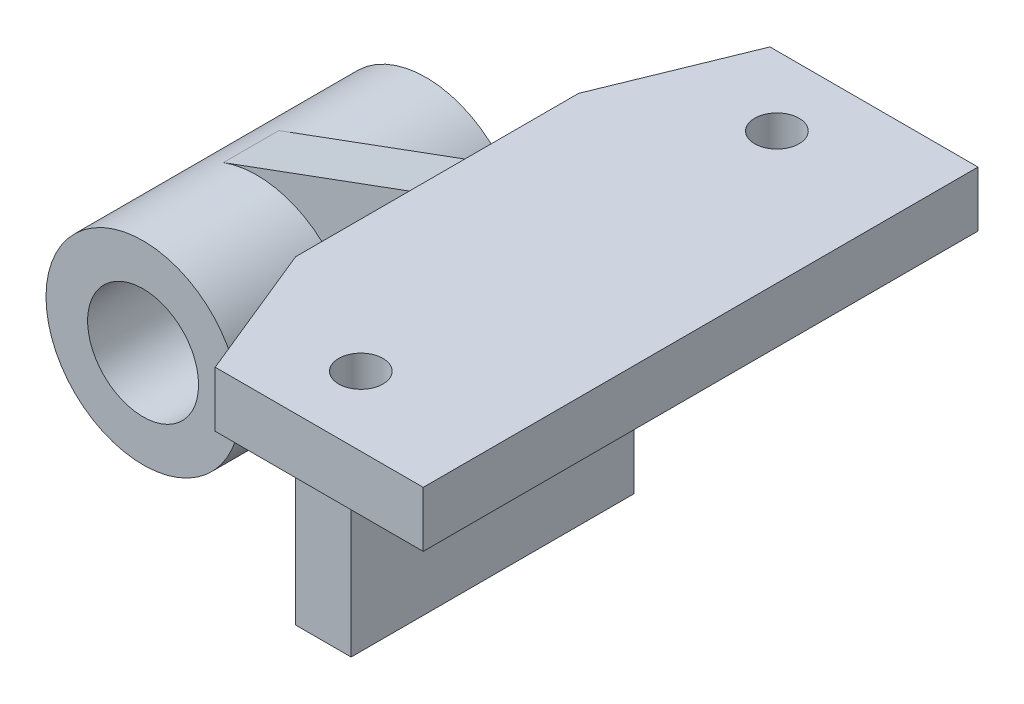
ISO-10303-21;
HEADER;
FILE_DESCRIPTION(('STEP AP214'),'2;1');
FILE_NAME('part.step','',(''),(''),'','','');
FILE_SCHEMA(('AUTOMOTIVE_DESIGN { 1 0 10303 214 1 1 1 1 }'));
ENDSEC;
DATA;
#1=APPLICATION_CONTEXT('core data for automotive mechanical design processes');
#2=APPLICATION_PROTOCOL_DEFINITION('international standard','automotive_design',2000,#1);
#3=PRODUCT_CONTEXT('',#1,'mechanical');
#4=PRODUCT('Part','Part','',(#3));
#5=PRODUCT_RELATED_PRODUCT_CATEGORY('part','',(#4));
#6=PRODUCT_DEFINITION_FORMATION('','',#4);
#7=PRODUCT_DEFINITION_CONTEXT('part definition',#1,'design');
#8=PRODUCT_DEFINITION('design','',#6,#7);
#9=PRODUCT_DEFINITION_SHAPE('','',#8);
#10=(LENGTH_UNIT() NAMED_UNIT(*) SI_UNIT(.MILLI.,.METRE.));
#11=(NAMED_UNIT(*) PLANE_ANGLE_UNIT() SI_UNIT($,.RADIAN.));
#12=(NAMED_UNIT(*) SI_UNIT($,.STERADIAN.) SOLID_ANGLE_UNIT());
#13=UNCERTAINTY_MEASURE_WITH_UNIT(LENGTH_MEASURE(1.E-05),#10,'distance_accuracy_value','');
#14=(GEOMETRIC_REPRESENTATION_CONTEXT(3) GLOBAL_UNCERTAINTY_ASSIGNED_CONTEXT((#13)) GLOBAL_UNIT_ASSIGNED_CONTEXT((#10,
#11,#12)) REPRESENTATION_CONTEXT('',''));
#15=CARTESIAN_POINT('',(0.,0.,0.));
#16=DIRECTION('',(0.,0.,1.));
#17=DIRECTION('',(1.,0.,0.));
#18=AXIS2_PLACEMENT_3D('',#15,#16,#17);
#19=CARTESIAN_POINT('',(0.,0.,20.4));
#20=DIRECTION('',(0.,0.,1.));
#21=DIRECTION('',(1.,0.,0.));
#22=AXIS2_PLACEMENT_3D('',#19,#20,#21);
#23=PLANE('',#22);
#24=CARTESIAN_POINT('',(0.,0.,20.4));
#25=DIRECTION('',(0.,0.,1.));
#26=DIRECTION('',(1.,0.,0.));
#27=AXIS2_PLACEMENT_3D('',#24,#25,#26);
#28=CIRCLE('',#27,4.);
#29=CARTESIAN_POINT('',(4.,0.,20.4));
#30=VERTEX_POINT('',#29);
#31=EDGE_CURVE('E388',#30,#30,#28,.T.);
#32=ORIENTED_EDGE('',*,*,#31,.F.);
#33=EDGE_LOOP('',(#32));
#34=FACE_BOUND('',#33,.T.);
#35=DIRECTION('',(0.,1.,0.));
#36=VECTOR('',#35,1.);
#37=CARTESIAN_POINT('',(15.,-11.5,20.4));
#38=LINE('',#37,#36);
#39=CARTESIAN_POINT('',(15.,-11.5,20.4));
#40=VERTEX_POINT('',#39);
#41=CARTESIAN_POINT('',(15.,7.5,20.4));
#42=VERTEX_POINT('',#41);
#43=EDGE_CURVE('E403',#40,#42,#38,.T.);
#44=ORIENTED_EDGE('',*,*,#43,.T.);
#45=DIRECTION('',(-1.,0.,0.));
#46=VECTOR('',#45,1.);
#47=CARTESIAN_POINT('',(0.,7.5,20.4));
#48=LINE('',#47,#46);
#49=CARTESIAN_POINT('',(11.,7.5,20.4));
#50=VERTEX_POINT('',#49);
#51=EDGE_CURVE('E256',#42,#50,#48,.T.);
#52=ORIENTED_EDGE('',*,*,#51,.T.);
#53=DIRECTION('',(0.,-1.,0.));
#54=VECTOR('',#53,1.);
#55=CARTESIAN_POINT('',(11.,0.,20.4));
#56=LINE('',#55,#54);
#57=CARTESIAN_POINT('',(11.,2.,20.4));
#58=VERTEX_POINT('',#57);
#59=EDGE_CURVE('E265',#50,#58,#56,.T.);
#60=ORIENTED_EDGE('',*,*,#59,.T.);
#61=DIRECTION('',(1.,0.,0.));
#62=VECTOR('',#61,1.);
#63=CARTESIAN_POINT('',(0.,2.,20.4));
#64=LINE('',#63,#62);
#65=CARTESIAN_POINT('',(6.70820393249937,2.,20.4));
#66=VERTEX_POINT('',#65);
#67=EDGE_CURVE('E261',#66,#58,#64,.T.);
#68=ORIENTED_EDGE('',*,*,#67,.F.);
#69=CARTESIAN_POINT('',(0.,0.,20.4));
#70=DIRECTION('',(0.,0.,1.));
#71=DIRECTION('',(1.,0.,0.));
#72=AXIS2_PLACEMENT_3D('',#69,#70,#71);
#73=CIRCLE('',#72,7.);
#74=CARTESIAN_POINT('',(6.70820393249937,-2.,20.4));
#75=VERTEX_POINT('',#74);
#76=EDGE_CURVE('E396',#66,#75,#73,.T.);
#77=ORIENTED_EDGE('',*,*,#76,.T.);
#78=DIRECTION('',(1.,0.,0.));
#79=VECTOR('',#78,1.);
#80=CARTESIAN_POINT('',(0.,-2.,20.4));
#81=LINE('',#80,#79);
#82=CARTESIAN_POINT('',(11.,-2.,20.4));
#83=VERTEX_POINT('',#82);
#84=EDGE_CURVE('E298',#75,#83,#81,.T.);
#85=ORIENTED_EDGE('',*,*,#84,.T.);
#86=DIRECTION('',(0.,-1.,0.));
#87=VECTOR('',#86,1.);
#88=CARTESIAN_POINT('',(11.,0.,20.4));
#89=LINE('',#88,#87);
#90=CARTESIAN_POINT('',(11.,-11.5,20.4));
#91=VERTEX_POINT('',#90);
#92=EDGE_CURVE('E294',#83,#91,#89,.T.);
#93=ORIENTED_EDGE('',*,*,#92,.T.);
#94=DIRECTION('',(1.,0.,0.));
#95=VECTOR('',#94,1.);
#96=CARTESIAN_POINT('',(15.,-11.5,20.4));
#97=LINE('',#96,#95);
#98=EDGE_CURVE('E399',#91,#40,#97,.T.);
#99=ORIENTED_EDGE('',*,*,#98,.T.);
#100=EDGE_LOOP('',(#44,#52,#60,#68,#77,#85,#93,#99));
#101=FACE_BOUND('',#100,.T.);
#102=ADVANCED_FACE('F47',(#34,#101),#23,.T.);
#103=CARTESIAN_POINT('',(0.,0.,0.));
#104=DIRECTION('',(0.,0.,1.));
#105=DIRECTION('',(1.,0.,0.));
#106=AXIS2_PLACEMENT_3D('',#103,#104,#105);
#107=PLANE('',#106);
#108=CARTESIAN_POINT('',(0.,0.,0.));
#109=DIRECTION('',(0.,0.,1.));
#110=DIRECTION('',(1.,0.,0.));
#111=AXIS2_PLACEMENT_3D('',#108,#109,#110);
#112=CIRCLE('',#111,4.);
#113=CARTESIAN_POINT('',(4.,0.,0.));
#114=VERTEX_POINT('',#113);
#115=EDGE_CURVE('E350',#114,#114,#112,.T.);
#116=ORIENTED_EDGE('',*,*,#115,.T.);
#117=EDGE_LOOP('',(#116));
#118=FACE_BOUND('',#117,.T.);
#119=DIRECTION('',(-1.,0.,0.));
#120=VECTOR('',#119,1.);
#121=CARTESIAN_POINT('',(0.,7.5,0.));
#122=LINE('',#121,#120);
#123=CARTESIAN_POINT('',(15.,7.5,0.));
#124=VERTEX_POINT('',#123);
#125=CARTESIAN_POINT('',(11.,7.5,0.));
#126=VERTEX_POINT('',#125);
#127=EDGE_CURVE('E248',#124,#126,#122,.T.);
#128=ORIENTED_EDGE('',*,*,#127,.F.);
#129=DIRECTION('',(0.,1.,0.));
#130=VECTOR('',#129,1.);
#131=CARTESIAN_POINT('',(15.,-11.5,0.));
#132=LINE('',#131,#130);
#133=CARTESIAN_POINT('',(15.,-11.5,0.));
#134=VERTEX_POINT('',#133);
#135=EDGE_CURVE('E400',#134,#124,#132,.T.);
#136=ORIENTED_EDGE('',*,*,#135,.F.);
#137=DIRECTION('',(1.,0.,0.));
#138=VECTOR('',#137,1.);
#139=CARTESIAN_POINT('',(15.,-11.5,0.));
#140=LINE('',#139,#138);
#141=CARTESIAN_POINT('',(11.,-11.5,0.));
#142=VERTEX_POINT('',#141);
#143=EDGE_CURVE('E409',#142,#134,#140,.T.);
#144=ORIENTED_EDGE('',*,*,#143,.F.);
#145=DIRECTION('',(0.,-1.,0.));
#146=VECTOR('',#145,1.);
#147=CARTESIAN_POINT('',(11.,0.,0.));
#148=LINE('',#147,#146);
#149=CARTESIAN_POINT('',(11.,-2.,0.));
#150=VERTEX_POINT('',#149);
#151=EDGE_CURVE('E357',#150,#142,#148,.T.);
#152=ORIENTED_EDGE('',*,*,#151,.F.);
#153=DIRECTION('',(1.,0.,0.));
#154=VECTOR('',#153,1.);
#155=CARTESIAN_POINT('',(0.,-2.,0.));
#156=LINE('',#155,#154);
#157=CARTESIAN_POINT('',(6.70820393249937,-2.,0.));
#158=VERTEX_POINT('',#157);
#159=EDGE_CURVE('E360',#158,#150,#156,.T.);
#160=ORIENTED_EDGE('',*,*,#159,.F.);
#161=CARTESIAN_POINT('',(0.,0.,0.));
#162=DIRECTION('',(0.,0.,1.));
#163=DIRECTION('',(1.,0.,0.));
#164=AXIS2_PLACEMENT_3D('',#161,#162,#163);
#165=CIRCLE('',#164,7.);
#166=CARTESIAN_POINT('',(6.70820393249937,2.,0.));
#167=VERTEX_POINT('',#166);
#168=EDGE_CURVE('E392',#167,#158,#165,.T.);
#169=ORIENTED_EDGE('',*,*,#168,.F.);
#170=DIRECTION('',(1.,0.,0.));
#171=VECTOR('',#170,1.);
#172=CARTESIAN_POINT('',(0.,2.,0.));
#173=LINE('',#172,#171);
#174=CARTESIAN_POINT('',(11.,2.,0.));
#175=VERTEX_POINT('',#174);
#176=EDGE_CURVE('E320',#167,#175,#173,.T.);
#177=ORIENTED_EDGE('',*,*,#176,.T.);
#178=DIRECTION('',(0.,-1.,0.));
#179=VECTOR('',#178,1.);
#180=CARTESIAN_POINT('',(11.,0.,0.));
#181=LINE('',#180,#179);
#182=EDGE_CURVE('E324',#126,#175,#181,.T.);
#183=ORIENTED_EDGE('',*,*,#182,.F.);
#184=EDGE_LOOP('',(#128,#136,#144,#152,#160,#169,#177,#183));
#185=FACE_BOUND('',#184,.T.);
#186=ADVANCED_FACE('F460',(#118,#185),#107,.F.);
#187=CARTESIAN_POINT('',(-2.41450849832377,-6.57039943317926,20.4));
#188=DIRECTION('',(0.344929785474824,0.93862849045418,0.));
#189=DIRECTION('',(-0.93862849045418,0.344929785474824,0.));
#190=AXIS2_PLACEMENT_3D('',#187,#188,#189);
#191=PLANE('',#190);
#192=DIRECTION('',(-0.93862849045418,0.344929785474824,0.));
#193=VECTOR('',#192,1.);
#194=CARTESIAN_POINT('',(-2.41450849832377,-6.57039943317926,12.2));
#195=LINE('',#194,#193);
#196=CARTESIAN_POINT('',(11.,-11.5,12.2));
#197=VERTEX_POINT('',#196);
#198=CARTESIAN_POINT('',(-2.41450849832377,-6.57039943317926,12.2));
#199=VERTEX_POINT('',#198);
#200=EDGE_CURVE('E307',#197,#199,#195,.T.);
#201=ORIENTED_EDGE('',*,*,#200,.T.);
#202=DIRECTION('',(0.,0.,-1.));
#203=VECTOR('',#202,1.);
#204=CARTESIAN_POINT('',(-2.41450849832377,-6.57039943317926,20.4));
#205=LINE('',#204,#203);
#206=CARTESIAN_POINT('',(-2.41450849832377,-6.57039943317926,8.2));
#207=VERTEX_POINT('',#206);
#208=EDGE_CURVE('E11',#199,#207,#205,.T.);
#209=ORIENTED_EDGE('',*,*,#208,.T.);
#210=DIRECTION('',(-0.93862849045418,0.344929785474824,0.));
#211=VECTOR('',#210,1.);
#212=CARTESIAN_POINT('',(-2.41450849832377,-6.57039943317926,8.2));
#213=LINE('',#212,#211);
#214=CARTESIAN_POINT('',(11.,-11.5,8.2));
#215=VERTEX_POINT('',#214);
#216=EDGE_CURVE('E368',#215,#207,#213,.T.);
#217=ORIENTED_EDGE('',*,*,#216,.F.);
#218=DIRECTION('',(0.,0.,-1.));
#219=VECTOR('',#218,1.);
#220=CARTESIAN_POINT('',(11.,-11.5,20.4));
#221=LINE('',#220,#219);
#222=EDGE_CURVE('E429',#197,#215,#221,.T.);
#223=ORIENTED_EDGE('',*,*,#222,.F.);
#224=EDGE_LOOP('',(#201,#209,#217,#223));
#225=FACE_BOUND('',#224,.T.);
#226=ADVANCED_FACE('F449',(#225),#191,.F.);
#227=CARTESIAN_POINT('',(-2.41450849832377,6.57039943317926,20.4));
#228=DIRECTION('',(0.344929785474824,-0.93862849045418,0.));
#229=DIRECTION('',(0.93862849045418,0.344929785474824,0.));
#230=AXIS2_PLACEMENT_3D('',#227,#228,#229);
#231=PLANE('',#230);
#232=DIRECTION('',(0.93862849045418,0.344929785474824,0.));
#233=VECTOR('',#232,1.);
#234=CARTESIAN_POINT('',(-2.41450849832377,6.57039943317926,12.2));
#235=LINE('',#234,#233);
#236=CARTESIAN_POINT('',(-2.41450849832377,6.57039943317926,12.2));
#237=VERTEX_POINT('',#236);
#238=CARTESIAN_POINT('',(11.,11.5,12.2));
#239=VERTEX_POINT('',#238);
#240=EDGE_CURVE('E272',#237,#239,#235,.T.);
#241=ORIENTED_EDGE('',*,*,#240,.T.);
#242=DIRECTION('',(0.,0.,-1.));
#243=VECTOR('',#242,1.);
#244=CARTESIAN_POINT('',(11.,11.5,20.4));
#245=LINE('',#244,#243);
#246=CARTESIAN_POINT('',(11.,11.5,8.2));
#247=VERTEX_POINT('',#246);
#248=EDGE_CURVE('E417',#239,#247,#245,.T.);
#249=ORIENTED_EDGE('',*,*,#248,.T.);
#250=DIRECTION('',(0.93862849045418,0.344929785474824,0.));
#251=VECTOR('',#250,1.);
#252=CARTESIAN_POINT('',(-2.41450849832377,6.57039943317926,8.2));
#253=LINE('',#252,#251);
#254=CARTESIAN_POINT('',(-2.41450849832377,6.57039943317926,8.2));
#255=VERTEX_POINT('',#254);
#256=EDGE_CURVE('E331',#255,#247,#253,.T.);
#257=ORIENTED_EDGE('',*,*,#256,.F.);
#258=DIRECTION('',(0.,0.,-1.));
#259=VECTOR('',#258,1.);
#260=CARTESIAN_POINT('',(-2.41450849832377,6.57039943317926,20.4));
#261=LINE('',#260,#259);
#262=EDGE_CURVE('E406',#237,#255,#261,.T.);
#263=ORIENTED_EDGE('',*,*,#262,.F.);
#264=EDGE_LOOP('',(#241,#249,#257,#263));
#265=FACE_BOUND('',#264,.T.);
#266=ADVANCED_FACE('F490',(#265),#231,.F.);
#267=CARTESIAN_POINT('',(0.,0.,20.4));
#268=DIRECTION('',(0.,0.,-1.));
#269=DIRECTION('',(-1.,0.,0.));
#270=AXIS2_PLACEMENT_3D('',#267,#268,#269);
#271=CYLINDRICAL_SURFACE('',#270,7.);
#272=ORIENTED_EDGE('',*,*,#168,.T.);
#273=DIRECTION('',(0.,0.,1.));
#274=VECTOR('',#273,1.);
#275=CARTESIAN_POINT('',(6.70820393249937,-2.,0.));
#276=LINE('',#275,#274);
#277=CARTESIAN_POINT('',(6.70820393249937,-2.,8.2));
#278=VERTEX_POINT('',#277);
#279=EDGE_CURVE('E336',#158,#278,#276,.T.);
#280=ORIENTED_EDGE('',*,*,#279,.T.);
#281=CARTESIAN_POINT('',(0.,0.,8.2));
#282=DIRECTION('',(0.,0.,1.));
#283=DIRECTION('',(1.,0.,0.));
#284=AXIS2_PLACEMENT_3D('',#281,#282,#283);
#285=CIRCLE('',#284,7.);
#286=EDGE_CURVE('E293',#207,#278,#285,.T.);
#287=ORIENTED_EDGE('',*,*,#286,.F.);
#288=ORIENTED_EDGE('',*,*,#208,.F.);
#289=CARTESIAN_POINT('',(0.,0.,12.2));
#290=DIRECTION('',(0.,0.,1.));
#291=DIRECTION('',(1.,0.,0.));
#292=AXIS2_PLACEMENT_3D('',#289,#290,#291);
#293=CIRCLE('',#292,7.);
#294=CARTESIAN_POINT('',(6.70820393249937,-2.,12.2));
#295=VERTEX_POINT('',#294);
#296=EDGE_CURVE('E260',#199,#295,#293,.T.);
#297=ORIENTED_EDGE('',*,*,#296,.T.);
#298=DIRECTION('',(0.,0.,-1.));
#299=VECTOR('',#298,1.);
#300=CARTESIAN_POINT('',(6.70820393249937,-2.,20.4));
#301=LINE('',#300,#299);
#302=EDGE_CURVE('E303',#75,#295,#301,.T.);
#303=ORIENTED_EDGE('',*,*,#302,.F.);
#304=ORIENTED_EDGE('',*,*,#76,.F.);
#305=DIRECTION('',(0.,0.,-1.));
#306=VECTOR('',#305,1.);
#307=CARTESIAN_POINT('',(6.70820393249937,2.,20.4));
#308=LINE('',#307,#306);
#309=CARTESIAN_POINT('',(6.70820393249937,2.,12.2));
#310=VERTEX_POINT('',#309);
#311=EDGE_CURVE('E289',#66,#310,#308,.T.);
#312=ORIENTED_EDGE('',*,*,#311,.T.);
#313=CARTESIAN_POINT('',(0.,0.,12.2));
#314=DIRECTION('',(0.,0.,1.));
#315=DIRECTION('',(1.,0.,0.));
#316=AXIS2_PLACEMENT_3D('',#313,#314,#315);
#317=CIRCLE('',#316,7.);
#318=EDGE_CURVE('E276',#237,#310,#317,.F.);
#319=ORIENTED_EDGE('',*,*,#318,.F.);
#320=ORIENTED_EDGE('',*,*,#262,.T.);
#321=CARTESIAN_POINT('',(0.,0.,8.2));
#322=DIRECTION('',(0.,0.,1.));
#323=DIRECTION('',(1.,0.,0.));
#324=AXIS2_PLACEMENT_3D('',#321,#322,#323);
#325=CIRCLE('',#324,7.);
#326=CARTESIAN_POINT('',(6.70820393249937,2.,8.2));
#327=VERTEX_POINT('',#326);
#328=EDGE_CURVE('E335',#255,#327,#325,.F.);
#329=ORIENTED_EDGE('',*,*,#328,.T.);
#330=DIRECTION('',(0.,0.,1.));
#331=VECTOR('',#330,1.);
#332=CARTESIAN_POINT('',(6.70820393249937,2.,0.));
#333=LINE('',#332,#331);
#334=EDGE_CURVE('E330',#167,#327,#333,.T.);
#335=ORIENTED_EDGE('',*,*,#334,.F.);
#336=EDGE_LOOP('',(#272,#280,#287,#288,#297,#303,#304,#312,#319,#320,#329,#335));
#337=FACE_BOUND('',#336,.T.);
#338=ADVANCED_FACE('F49',(#337),#271,.T.);
#339=CARTESIAN_POINT('',(15.,-11.5,20.4));
#340=DIRECTION('',(0.,1.,0.));
#341=DIRECTION('',(0.,0.,1.));
#342=AXIS2_PLACEMENT_3D('',#339,#340,#341);
#343=PLANE('',#342);
#344=ORIENTED_EDGE('',*,*,#143,.T.);
#345=DIRECTION('',(0.,0.,-1.));
#346=VECTOR('',#345,1.);
#347=CARTESIAN_POINT('',(15.,-11.5,20.4));
#348=LINE('',#347,#346);
#349=EDGE_CURVE('E426',#40,#134,#348,.T.);
#350=ORIENTED_EDGE('',*,*,#349,.F.);
#351=ORIENTED_EDGE('',*,*,#98,.F.);
#352=EDGE_CURVE('E56',#91,#197,#221,.T.);
#353=ORIENTED_EDGE('',*,*,#352,.T.);
#354=ORIENTED_EDGE('',*,*,#222,.T.);
#355=DIRECTION('',(0.,0.,1.));
#356=VECTOR('',#355,1.);
#357=CARTESIAN_POINT('',(11.,-11.5,0.));
#358=LINE('',#357,#356);
#359=EDGE_CURVE('E364',#142,#215,#358,.T.);
#360=ORIENTED_EDGE('',*,*,#359,.F.);
#361=EDGE_LOOP('',(#344,#350,#351,#353,#354,#360));
#362=FACE_BOUND('',#361,.T.);
#363=ADVANCED_FACE('F437',(#362),#343,.F.);
#364=CARTESIAN_POINT('',(15.,-11.5,20.4));
#365=DIRECTION('',(-1.,0.,0.));
#366=DIRECTION('',(0.,0.,1.));
#367=AXIS2_PLACEMENT_3D('',#364,#365,#366);
#368=PLANE('',#367);
#369=ORIENTED_EDGE('',*,*,#135,.T.);
#370=DIRECTION('',(0.,0.,-1.));
#371=VECTOR('',#370,1.);
#372=CARTESIAN_POINT('',(15.,7.5,20.4));
#373=LINE('',#372,#371);
#374=EDGE_CURVE('E202',#42,#124,#373,.T.);
#375=ORIENTED_EDGE('',*,*,#374,.F.);
#376=ORIENTED_EDGE('',*,*,#43,.F.);
#377=ORIENTED_EDGE('',*,*,#349,.T.);
#378=EDGE_LOOP('',(#369,#375,#376,#377));
#379=FACE_BOUND('',#378,.T.);
#380=ADVANCED_FACE('F465',(#379),#368,.F.);
#381=CARTESIAN_POINT('',(15.,7.5,20.4));
#382=DIRECTION('',(0.,1.,0.));
#383=DIRECTION('',(0.,0.,1.));
#384=AXIS2_PLACEMENT_3D('',#381,#382,#383);
#385=PLANE('',#384);
#386=CARTESIAN_POINT('',(20.5,7.5,-4.8));
#387=DIRECTION('',(0.,1.,0.));
#388=DIRECTION('',(0.,0.,1.));
#389=AXIS2_PLACEMENT_3D('',#386,#387,#388);
#390=CIRCLE('',#389,1.60000000000001);
#391=CARTESIAN_POINT('',(20.5,7.5,-3.2));
#392=VERTEX_POINT('',#391);
#393=EDGE_CURVE('E239',#392,#392,#390,.F.);
#394=ORIENTED_EDGE('',*,*,#393,.F.);
#395=EDGE_LOOP('',(#394));
#396=FACE_BOUND('',#395,.T.);
#397=CARTESIAN_POINT('',(20.5,7.5,25.2));
#398=DIRECTION('',(0.,1.,0.));
#399=DIRECTION('',(0.,0.,1.));
#400=AXIS2_PLACEMENT_3D('',#397,#398,#399);
#401=CIRCLE('',#400,1.6);
#402=CARTESIAN_POINT('',(20.5,7.5,26.8));
#403=VERTEX_POINT('',#402);
#404=EDGE_CURVE('E702',#403,#403,#401,.F.);
#405=ORIENTED_EDGE('',*,*,#404,.F.);
#406=EDGE_LOOP('',(#405));
#407=FACE_BOUND('',#406,.T.);
#408=ORIENTED_EDGE('',*,*,#374,.T.);
#409=ORIENTED_EDGE('',*,*,#127,.T.);
#410=DIRECTION('',(-0.377840786818464,0.,0.925870584809996));
#411=VECTOR('',#410,1.);
#412=CARTESIAN_POINT('',(11.,7.5,0.));
#413=LINE('',#412,#411);
#414=CARTESIAN_POINT('',(14.9993059198234,7.5,-9.79999999999999));
#415=VERTEX_POINT('',#414);
#416=EDGE_CURVE('E63',#415,#126,#413,.T.);
#417=ORIENTED_EDGE('',*,*,#416,.F.);
#418=DIRECTION('',(-1.,0.,0.));
#419=VECTOR('',#418,1.);
#420=CARTESIAN_POINT('',(14.9993059198234,7.5,-9.79999999999999));
#421=LINE('',#420,#419);
#422=CARTESIAN_POINT('',(30.,7.5,-9.8));
#423=VERTEX_POINT('',#422);
#424=EDGE_CURVE('E208',#423,#415,#421,.T.);
#425=ORIENTED_EDGE('',*,*,#424,.F.);
#426=DIRECTION('',(0.,0.,-1.));
#427=VECTOR('',#426,1.);
#428=CARTESIAN_POINT('',(30.,7.5,20.4));
#429=LINE('',#428,#427);
#430=CARTESIAN_POINT('',(30.,7.5,30.2));
#431=VERTEX_POINT('',#430);
#432=EDGE_CURVE('E190',#431,#423,#429,.T.);
#433=ORIENTED_EDGE('',*,*,#432,.F.);
#434=DIRECTION('',(1.,0.,0.));
#435=VECTOR('',#434,1.);
#436=CARTESIAN_POINT('',(14.9993059198234,7.5,30.2));
#437=LINE('',#436,#435);
#438=CARTESIAN_POINT('',(14.9993059198234,7.5,30.2));
#439=VERTEX_POINT('',#438);
#440=EDGE_CURVE('E213',#439,#431,#437,.T.);
#441=ORIENTED_EDGE('',*,*,#440,.F.);
#442=DIRECTION('',(0.377840786818465,0.,0.925870584809996));
#443=VECTOR('',#442,1.);
#444=CARTESIAN_POINT('',(11.,7.5,20.4));
#445=LINE('',#444,#443);
#446=EDGE_CURVE('E222',#50,#439,#445,.T.);
#447=ORIENTED_EDGE('',*,*,#446,.F.);
#448=ORIENTED_EDGE('',*,*,#51,.F.);
#449=EDGE_LOOP('',(#408,#409,#417,#425,#433,#441,#447,#448));
#450=FACE_BOUND('',#449,.T.);
#451=ADVANCED_FACE('F216',(#396,#407,#450),#385,.F.);
#452=CARTESIAN_POINT('',(30.,7.5,20.4));
#453=DIRECTION('',(-1.,0.,0.));
#454=DIRECTION('',(0.,0.,1.));
#455=AXIS2_PLACEMENT_3D('',#452,#453,#454);
#456=PLANE('',#455);
#457=ORIENTED_EDGE('',*,*,#432,.T.);
#458=DIRECTION('',(0.,1.,0.));
#459=VECTOR('',#458,1.);
#460=CARTESIAN_POINT('',(30.,7.5,-9.8));
#461=LINE('',#460,#459);
#462=CARTESIAN_POINT('',(30.,11.5,-9.8));
#463=VERTEX_POINT('',#462);
#464=EDGE_CURVE('E193',#423,#463,#461,.T.);
#465=ORIENTED_EDGE('',*,*,#464,.T.);
#466=DIRECTION('',(0.,0.,-1.));
#467=VECTOR('',#466,1.);
#468=CARTESIAN_POINT('',(30.,11.5,20.4));
#469=LINE('',#468,#467);
#470=CARTESIAN_POINT('',(30.,11.5,30.2));
#471=VERTEX_POINT('',#470);
#472=EDGE_CURVE('E203',#471,#463,#469,.T.);
#473=ORIENTED_EDGE('',*,*,#472,.F.);
#474=DIRECTION('',(0.,1.,0.));
#475=VECTOR('',#474,1.);
#476=CARTESIAN_POINT('',(30.,7.5,30.2));
#477=LINE('',#476,#475);
#478=EDGE_CURVE('E196',#431,#471,#477,.T.);
#479=ORIENTED_EDGE('',*,*,#478,.F.);
#480=EDGE_LOOP('',(#457,#465,#473,#479));
#481=FACE_BOUND('',#480,.T.);
#482=ADVANCED_FACE('F192',(#481),#456,.F.);
#483=CARTESIAN_POINT('',(11.,11.5,20.4));
#484=DIRECTION('',(0.,-1.,0.));
#485=DIRECTION('',(0.,0.,-1.));
#486=AXIS2_PLACEMENT_3D('',#483,#484,#485);
#487=PLANE('',#486);
#488=CARTESIAN_POINT('',(20.5,11.5,-4.8));
#489=DIRECTION('',(0.,1.,0.));
#490=DIRECTION('',(0.,0.,1.));
#491=AXIS2_PLACEMENT_3D('',#488,#489,#490);
#492=CIRCLE('',#491,1.60000000000001);
#493=CARTESIAN_POINT('',(20.5,11.5,-3.2));
#494=VERTEX_POINT('',#493);
#495=EDGE_CURVE('E695',#494,#494,#492,.T.);
#496=ORIENTED_EDGE('',*,*,#495,.F.);
#497=EDGE_LOOP('',(#496));
#498=FACE_BOUND('',#497,.T.);
#499=CARTESIAN_POINT('',(20.5,11.5,25.2));
#500=DIRECTION('',(0.,1.,0.));
#501=DIRECTION('',(0.,0.,1.));
#502=AXIS2_PLACEMENT_3D('',#499,#500,#501);
#503=CIRCLE('',#502,1.6);
#504=CARTESIAN_POINT('',(20.5,11.5,26.8));
#505=VERTEX_POINT('',#504);
#506=EDGE_CURVE('E228',#505,#505,#503,.T.);
#507=ORIENTED_EDGE('',*,*,#506,.F.);
#508=EDGE_LOOP('',(#507));
#509=FACE_BOUND('',#508,.T.);
#510=ORIENTED_EDGE('',*,*,#472,.T.);
#511=DIRECTION('',(-1.,0.,0.));
#512=VECTOR('',#511,1.);
#513=CARTESIAN_POINT('',(14.9993059198234,11.5,-9.79999999999999));
#514=LINE('',#513,#512);
#515=CARTESIAN_POINT('',(14.9993059198234,11.5,-9.79999999999999));
#516=VERTEX_POINT('',#515);
#517=EDGE_CURVE('E210',#463,#516,#514,.T.);
#518=ORIENTED_EDGE('',*,*,#517,.T.);
#519=DIRECTION('',(-0.377840786818464,0.,0.925870584809996));
#520=VECTOR('',#519,1.);
#521=CARTESIAN_POINT('',(11.,11.5,0.));
#522=LINE('',#521,#520);
#523=CARTESIAN_POINT('',(11.,11.5,0.));
#524=VERTEX_POINT('',#523);
#525=EDGE_CURVE('E238',#516,#524,#522,.T.);
#526=ORIENTED_EDGE('',*,*,#525,.T.);
#527=DIRECTION('',(0.,0.,1.));
#528=VECTOR('',#527,1.);
#529=CARTESIAN_POINT('',(11.,11.5,0.));
#530=LINE('',#529,#528);
#531=EDGE_CURVE('E346',#524,#247,#530,.T.);
#532=ORIENTED_EDGE('',*,*,#531,.T.);
#533=ORIENTED_EDGE('',*,*,#248,.F.);
#534=CARTESIAN_POINT('',(11.,11.5,20.4));
#535=VERTEX_POINT('',#534);
#536=EDGE_CURVE('E418',#535,#239,#245,.T.);
#537=ORIENTED_EDGE('',*,*,#536,.F.);
#538=DIRECTION('',(0.377840786818465,0.,0.925870584809996));
#539=VECTOR('',#538,1.);
#540=CARTESIAN_POINT('',(11.,11.5,20.4));
#541=LINE('',#540,#539);
#542=CARTESIAN_POINT('',(14.9993059198234,11.5,30.2));
#543=VERTEX_POINT('',#542);
#544=EDGE_CURVE('E225',#535,#543,#541,.T.);
#545=ORIENTED_EDGE('',*,*,#544,.T.);
#546=DIRECTION('',(1.,0.,0.));
#547=VECTOR('',#546,1.);
#548=CARTESIAN_POINT('',(14.9993059198234,11.5,30.2));
#549=LINE('',#548,#547);
#550=EDGE_CURVE('E218',#543,#471,#549,.T.);
#551=ORIENTED_EDGE('',*,*,#550,.T.);
#552=EDGE_LOOP('',(#510,#518,#526,#532,#533,#537,#545,#551));
#553=FACE_BOUND('',#552,.T.);
#554=ADVANCED_FACE('F503',(#498,#509,#553),#487,.F.);
#555=CARTESIAN_POINT('',(0.,0.,20.4));
#556=DIRECTION('',(0.,0.,-1.));
#557=DIRECTION('',(-1.,0.,0.));
#558=AXIS2_PLACEMENT_3D('',#555,#556,#557);
#559=CYLINDRICAL_SURFACE('',#558,4.);
#560=ORIENTED_EDGE('',*,*,#31,.T.);
#561=EDGE_LOOP('',(#560));
#562=FACE_BOUND('',#561,.T.);
#563=ORIENTED_EDGE('',*,*,#115,.F.);
#564=EDGE_LOOP('',(#563));
#565=FACE_BOUND('',#564,.T.);
#566=ADVANCED_FACE('F540',(#562,#565),#559,.F.);
#567=CARTESIAN_POINT('',(11.,0.,0.));
#568=DIRECTION('',(-1.,0.,0.));
#569=DIRECTION('',(0.,-1.,0.));
#570=AXIS2_PLACEMENT_3D('',#567,#568,#569);
#571=PLANE('',#570);
#572=EDGE_CURVE('E326',#524,#126,#181,.T.);
#573=ORIENTED_EDGE('',*,*,#572,.T.);
#574=ORIENTED_EDGE('',*,*,#182,.T.);
#575=DIRECTION('',(0.,0.,1.));
#576=VECTOR('',#575,1.);
#577=CARTESIAN_POINT('',(11.,2.,0.));
#578=LINE('',#577,#576);
#579=CARTESIAN_POINT('',(11.,2.,8.2));
#580=VERTEX_POINT('',#579);
#581=EDGE_CURVE('E351',#175,#580,#578,.T.);
#582=ORIENTED_EDGE('',*,*,#581,.T.);
#583=DIRECTION('',(0.,-1.,0.));
#584=VECTOR('',#583,1.);
#585=CARTESIAN_POINT('',(11.,0.,8.2));
#586=LINE('',#585,#584);
#587=EDGE_CURVE('E325',#247,#580,#586,.T.);
#588=ORIENTED_EDGE('',*,*,#587,.F.);
#589=ORIENTED_EDGE('',*,*,#531,.F.);
#590=EDGE_LOOP('',(#573,#574,#582,#588,#589));
#591=FACE_BOUND('',#590,.T.);
#592=ADVANCED_FACE('F497',(#591),#571,.T.);
#593=CARTESIAN_POINT('',(0.,2.,0.));
#594=DIRECTION('',(0.,-1.,0.));
#595=DIRECTION('',(0.,0.,-1.));
#596=AXIS2_PLACEMENT_3D('',#593,#594,#595);
#597=PLANE('',#596);
#598=DIRECTION('',(1.,0.,0.));
#599=VECTOR('',#598,1.);
#600=CARTESIAN_POINT('',(0.,2.,8.2));
#601=LINE('',#600,#599);
#602=EDGE_CURVE('E340',#327,#580,#601,.T.);
#603=ORIENTED_EDGE('',*,*,#602,.T.);
#604=ORIENTED_EDGE('',*,*,#581,.F.);
#605=ORIENTED_EDGE('',*,*,#176,.F.);
#606=ORIENTED_EDGE('',*,*,#334,.T.);
#607=EDGE_LOOP('',(#603,#604,#605,#606));
#608=FACE_BOUND('',#607,.T.);
#609=ADVANCED_FACE('F509',(#608),#597,.F.);
#610=CARTESIAN_POINT('',(0.,0.,8.2));
#611=DIRECTION('',(0.,0.,1.));
#612=DIRECTION('',(1.,0.,0.));
#613=AXIS2_PLACEMENT_3D('',#610,#611,#612);
#614=PLANE('',#613);
#615=ORIENTED_EDGE('',*,*,#256,.T.);
#616=ORIENTED_EDGE('',*,*,#587,.T.);
#617=ORIENTED_EDGE('',*,*,#602,.F.);
#618=ORIENTED_EDGE('',*,*,#328,.F.);
#619=EDGE_LOOP('',(#615,#616,#617,#618));
#620=FACE_BOUND('',#619,.T.);
#621=ADVANCED_FACE('F502',(#620),#614,.F.);
#622=CARTESIAN_POINT('',(0.,-2.,0.));
#623=DIRECTION('',(0.,-1.,0.));
#624=DIRECTION('',(0.,0.,-1.));
#625=AXIS2_PLACEMENT_3D('',#622,#623,#624);
#626=PLANE('',#625);
#627=DIRECTION('',(1.,0.,0.));
#628=VECTOR('',#627,1.);
#629=CARTESIAN_POINT('',(0.,-2.,8.2));
#630=LINE('',#629,#628);
#631=CARTESIAN_POINT('',(11.,-2.,8.2));
#632=VERTEX_POINT('',#631);
#633=EDGE_CURVE('E361',#278,#632,#630,.T.);
#634=ORIENTED_EDGE('',*,*,#633,.F.);
#635=ORIENTED_EDGE('',*,*,#279,.F.);
#636=ORIENTED_EDGE('',*,*,#159,.T.);
#637=DIRECTION('',(0.,0.,1.));
#638=VECTOR('',#637,1.);
#639=CARTESIAN_POINT('',(11.,-2.,0.));
#640=LINE('',#639,#638);
#641=EDGE_CURVE('E381',#150,#632,#640,.T.);
#642=ORIENTED_EDGE('',*,*,#641,.T.);
#643=EDGE_LOOP('',(#634,#635,#636,#642));
#644=FACE_BOUND('',#643,.T.);
#645=ADVANCED_FACE('F458',(#644),#626,.T.);
#646=CARTESIAN_POINT('',(11.,0.,0.));
#647=DIRECTION('',(-1.,0.,0.));
#648=DIRECTION('',(0.,0.,1.));
#649=AXIS2_PLACEMENT_3D('',#646,#647,#648);
#650=PLANE('',#649);
#651=DIRECTION('',(0.,-1.,0.));
#652=VECTOR('',#651,1.);
#653=CARTESIAN_POINT('',(11.,0.,8.2));
#654=LINE('',#653,#652);
#655=EDGE_CURVE('E372',#632,#215,#654,.T.);
#656=ORIENTED_EDGE('',*,*,#655,.F.);
#657=ORIENTED_EDGE('',*,*,#641,.F.);
#658=ORIENTED_EDGE('',*,*,#151,.T.);
#659=ORIENTED_EDGE('',*,*,#359,.T.);
#660=EDGE_LOOP('',(#656,#657,#658,#659));
#661=FACE_BOUND('',#660,.T.);
#662=ADVANCED_FACE('F447',(#661),#650,.T.);
#663=CARTESIAN_POINT('',(0.,0.,8.2));
#664=DIRECTION('',(0.,0.,1.));
#665=DIRECTION('',(1.,0.,0.));
#666=AXIS2_PLACEMENT_3D('',#663,#664,#665);
#667=PLANE('',#666);
#668=ORIENTED_EDGE('',*,*,#286,.T.);
#669=ORIENTED_EDGE('',*,*,#633,.T.);
#670=ORIENTED_EDGE('',*,*,#655,.T.);
#671=ORIENTED_EDGE('',*,*,#216,.T.);
#672=EDGE_LOOP('',(#668,#669,#670,#671));
#673=FACE_BOUND('',#672,.T.);
#674=ADVANCED_FACE('F443',(#673),#667,.F.);
#675=CARTESIAN_POINT('',(0.,2.,20.4));
#676=DIRECTION('',(0.,1.,0.));
#677=DIRECTION('',(0.,0.,1.));
#678=AXIS2_PLACEMENT_3D('',#675,#676,#677);
#679=PLANE('',#678);
#680=DIRECTION('',(1.,0.,0.));
#681=VECTOR('',#680,1.);
#682=CARTESIAN_POINT('',(0.,2.,12.2));
#683=LINE('',#682,#681);
#684=CARTESIAN_POINT('',(11.,2.,12.2));
#685=VERTEX_POINT('',#684);
#686=EDGE_CURVE('E280',#310,#685,#683,.T.);
#687=ORIENTED_EDGE('',*,*,#686,.F.);
#688=ORIENTED_EDGE('',*,*,#311,.F.);
#689=ORIENTED_EDGE('',*,*,#67,.T.);
#690=DIRECTION('',(0.,0.,-1.));
#691=VECTOR('',#690,1.);
#692=CARTESIAN_POINT('',(11.,2.,20.4));
#693=LINE('',#692,#691);
#694=EDGE_CURVE('E271',#58,#685,#693,.T.);
#695=ORIENTED_EDGE('',*,*,#694,.T.);
#696=EDGE_LOOP('',(#687,#688,#689,#695));
#697=FACE_BOUND('',#696,.T.);
#698=ADVANCED_FACE('F480',(#697),#679,.T.);
#699=CARTESIAN_POINT('',(11.,0.,20.4));
#700=DIRECTION('',(1.,0.,0.));
#701=DIRECTION('',(0.,1.,0.));
#702=AXIS2_PLACEMENT_3D('',#699,#700,#701);
#703=PLANE('',#702);
#704=DIRECTION('',(0.,-1.,0.));
#705=VECTOR('',#704,1.);
#706=CARTESIAN_POINT('',(11.,0.,12.2));
#707=LINE('',#706,#705);
#708=EDGE_CURVE('E266',#239,#685,#707,.T.);
#709=ORIENTED_EDGE('',*,*,#708,.T.);
#710=ORIENTED_EDGE('',*,*,#694,.F.);
#711=ORIENTED_EDGE('',*,*,#59,.F.);
#712=EDGE_CURVE('E267',#535,#50,#56,.T.);
#713=ORIENTED_EDGE('',*,*,#712,.F.);
#714=ORIENTED_EDGE('',*,*,#536,.T.);
#715=EDGE_LOOP('',(#709,#710,#711,#713,#714));
#716=FACE_BOUND('',#715,.T.);
#717=ADVANCED_FACE('F512',(#716),#703,.F.);
#718=CARTESIAN_POINT('',(0.,0.,12.2));
#719=DIRECTION('',(0.,0.,1.));
#720=DIRECTION('',(1.,0.,0.));
#721=AXIS2_PLACEMENT_3D('',#718,#719,#720);
#722=PLANE('',#721);
#723=ORIENTED_EDGE('',*,*,#240,.F.);
#724=ORIENTED_EDGE('',*,*,#318,.T.);
#725=ORIENTED_EDGE('',*,*,#686,.T.);
#726=ORIENTED_EDGE('',*,*,#708,.F.);
#727=EDGE_LOOP('',(#723,#724,#725,#726));
#728=FACE_BOUND('',#727,.T.);
#729=ADVANCED_FACE('F511',(#728),#722,.T.);
#730=CARTESIAN_POINT('',(11.,0.,20.4));
#731=DIRECTION('',(1.,0.,0.));
#732=DIRECTION('',(0.,0.,-1.));
#733=AXIS2_PLACEMENT_3D('',#730,#731,#732);
#734=PLANE('',#733);
#735=DIRECTION('',(0.,-1.,0.));
#736=VECTOR('',#735,1.);
#737=CARTESIAN_POINT('',(11.,0.,12.2));
#738=LINE('',#737,#736);
#739=CARTESIAN_POINT('',(11.,-2.,12.2));
#740=VERTEX_POINT('',#739);
#741=EDGE_CURVE('E71',#740,#197,#738,.T.);
#742=ORIENTED_EDGE('',*,*,#741,.T.);
#743=ORIENTED_EDGE('',*,*,#352,.F.);
#744=ORIENTED_EDGE('',*,*,#92,.F.);
#745=DIRECTION('',(0.,0.,-1.));
#746=VECTOR('',#745,1.);
#747=CARTESIAN_POINT('',(11.,-2.,20.4));
#748=LINE('',#747,#746);
#749=EDGE_CURVE('E277',#83,#740,#748,.T.);
#750=ORIENTED_EDGE('',*,*,#749,.T.);
#751=EDGE_LOOP('',(#742,#743,#744,#750));
#752=FACE_BOUND('',#751,.T.);
#753=ADVANCED_FACE('F471',(#752),#734,.F.);
#754=CARTESIAN_POINT('',(0.,-2.,20.4));
#755=DIRECTION('',(0.,1.,0.));
#756=DIRECTION('',(0.,0.,1.));
#757=AXIS2_PLACEMENT_3D('',#754,#755,#756);
#758=PLANE('',#757);
#759=DIRECTION('',(1.,0.,0.));
#760=VECTOR('',#759,1.);
#761=CARTESIAN_POINT('',(0.,-2.,12.2));
#762=LINE('',#761,#760);
#763=EDGE_CURVE('E299',#295,#740,#762,.T.);
#764=ORIENTED_EDGE('',*,*,#763,.T.);
#765=ORIENTED_EDGE('',*,*,#749,.F.);
#766=ORIENTED_EDGE('',*,*,#84,.F.);
#767=ORIENTED_EDGE('',*,*,#302,.T.);
#768=EDGE_LOOP('',(#764,#765,#766,#767));
#769=FACE_BOUND('',#768,.T.);
#770=ADVANCED_FACE('F475',(#769),#758,.F.);
#771=CARTESIAN_POINT('',(0.,0.,12.2));
#772=DIRECTION('',(0.,0.,1.));
#773=DIRECTION('',(1.,0.,0.));
#774=AXIS2_PLACEMENT_3D('',#771,#772,#773);
#775=PLANE('',#774);
#776=ORIENTED_EDGE('',*,*,#296,.F.);
#777=ORIENTED_EDGE('',*,*,#200,.F.);
#778=ORIENTED_EDGE('',*,*,#741,.F.);
#779=ORIENTED_EDGE('',*,*,#763,.F.);
#780=EDGE_LOOP('',(#776,#777,#778,#779));
#781=FACE_BOUND('',#780,.T.);
#782=ADVANCED_FACE('F474',(#781),#775,.T.);
#783=CARTESIAN_POINT('',(14.9993059198234,7.5,30.2));
#784=DIRECTION('',(0.,0.,1.));
#785=DIRECTION('',(1.,0.,0.));
#786=AXIS2_PLACEMENT_3D('',#783,#784,#785);
#787=PLANE('',#786);
#788=ORIENTED_EDGE('',*,*,#550,.F.);
#789=DIRECTION('',(0.,1.,0.));
#790=VECTOR('',#789,1.);
#791=CARTESIAN_POINT('',(14.9993059198234,7.5,30.2));
#792=LINE('',#791,#790);
#793=EDGE_CURVE('E249',#439,#543,#792,.T.);
#794=ORIENTED_EDGE('',*,*,#793,.F.);
#795=ORIENTED_EDGE('',*,*,#440,.T.);
#796=ORIENTED_EDGE('',*,*,#478,.T.);
#797=EDGE_LOOP('',(#788,#794,#795,#796));
#798=FACE_BOUND('',#797,.T.);
#799=ADVANCED_FACE('F519',(#798),#787,.T.);
#800=CARTESIAN_POINT('',(11.,7.5,20.4));
#801=DIRECTION('',(-0.925870584809996,0.,0.377840786818465));
#802=DIRECTION('',(0.377840786818465,0.,0.925870584809996));
#803=AXIS2_PLACEMENT_3D('',#800,#801,#802);
#804=PLANE('',#803);
#805=ORIENTED_EDGE('',*,*,#544,.F.);
#806=ORIENTED_EDGE('',*,*,#712,.T.);
#807=ORIENTED_EDGE('',*,*,#446,.T.);
#808=ORIENTED_EDGE('',*,*,#793,.T.);
#809=EDGE_LOOP('',(#805,#806,#807,#808));
#810=FACE_BOUND('',#809,.T.);
#811=ADVANCED_FACE('F516',(#810),#804,.T.);
#812=CARTESIAN_POINT('',(11.,7.5,0.));
#813=DIRECTION('',(-0.925870584809996,0.,-0.377840786818464));
#814=DIRECTION('',(-0.377840786818464,0.,0.925870584809996));
#815=AXIS2_PLACEMENT_3D('',#812,#813,#814);
#816=PLANE('',#815);
#817=ORIENTED_EDGE('',*,*,#525,.F.);
#818=DIRECTION('',(0.,1.,0.));
#819=VECTOR('',#818,1.);
#820=CARTESIAN_POINT('',(14.9993059198234,7.5,-9.79999999999999));
#821=LINE('',#820,#819);
#822=EDGE_CURVE('E212',#415,#516,#821,.T.);
#823=ORIENTED_EDGE('',*,*,#822,.F.);
#824=ORIENTED_EDGE('',*,*,#416,.T.);
#825=ORIENTED_EDGE('',*,*,#572,.F.);
#826=EDGE_LOOP('',(#817,#823,#824,#825));
#827=FACE_BOUND('',#826,.T.);
#828=ADVANCED_FACE('F505',(#827),#816,.T.);
#829=CARTESIAN_POINT('',(14.9993059198234,7.5,-9.79999999999999));
#830=DIRECTION('',(0.,0.,-1.));
#831=DIRECTION('',(-1.,0.,0.));
#832=AXIS2_PLACEMENT_3D('',#829,#830,#831);
#833=PLANE('',#832);
#834=ORIENTED_EDGE('',*,*,#517,.F.);
#835=ORIENTED_EDGE('',*,*,#464,.F.);
#836=ORIENTED_EDGE('',*,*,#424,.T.);
#837=ORIENTED_EDGE('',*,*,#822,.T.);
#838=EDGE_LOOP('',(#834,#835,#836,#837));
#839=FACE_BOUND('',#838,.T.);
#840=ADVANCED_FACE('F207',(#839),#833,.T.);
#841=CARTESIAN_POINT('',(20.5,-11.501,25.2));
#842=DIRECTION('',(0.,1.,0.));
#843=DIRECTION('',(0.,0.,1.));
#844=AXIS2_PLACEMENT_3D('',#841,#842,#843);
#845=CYLINDRICAL_SURFACE('',#844,1.6);
#846=ORIENTED_EDGE('',*,*,#506,.T.);
#847=EDGE_LOOP('',(#846));
#848=FACE_BOUND('',#847,.T.);
#849=ORIENTED_EDGE('',*,*,#404,.T.);
#850=EDGE_LOOP('',(#849));
#851=FACE_BOUND('',#850,.T.);
#852=ADVANCED_FACE('F672',(#848,#851),#845,.F.);
#853=CARTESIAN_POINT('',(20.5,-11.501,-4.8));
#854=DIRECTION('',(0.,1.,0.));
#855=DIRECTION('',(0.,0.,1.));
#856=AXIS2_PLACEMENT_3D('',#853,#854,#855);
#857=CYLINDRICAL_SURFACE('',#856,1.60000000000001);
#858=ORIENTED_EDGE('',*,*,#495,.T.);
#859=EDGE_LOOP('',(#858));
#860=FACE_BOUND('',#859,.T.);
#861=ORIENTED_EDGE('',*,*,#393,.T.);
#862=EDGE_LOOP('',(#861));
#863=FACE_BOUND('',#862,.T.);
#864=ADVANCED_FACE('F680',(#860,#863),#857,.F.);
#865=CLOSED_SHELL('',(#102,#186,#226,#266,#338,#363,#380,#451,#482,#554,#566,#592,#609,#621,
#645,#662,#674,#698,#717,#729,#753,#770,#782,#799,#811,#828,#840,#852,#864));
#866=MANIFOLD_SOLID_BREP('B2',#865);
#867=ADVANCED_BREP_SHAPE_REPRESENTATION('',(#18,#866),#14);
#868=SHAPE_DEFINITION_REPRESENTATION(#9,#867);
ENDSEC;
END-ISO-10303-21;
